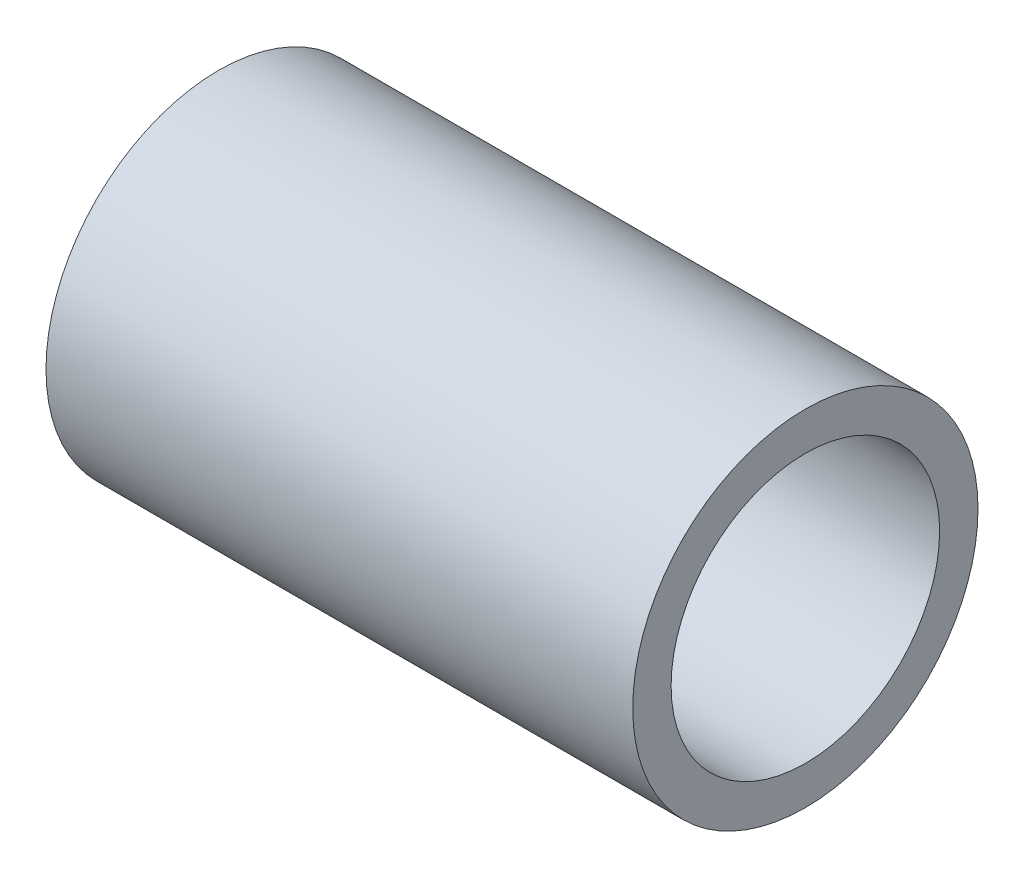
ISO-10303-21;
HEADER;
FILE_DESCRIPTION(('STEP AP214'),'2;1');
FILE_NAME('part.step','',(''),(''),'','','');
FILE_SCHEMA(('AUTOMOTIVE_DESIGN { 1 0 10303 214 1 1 1 1 }'));
ENDSEC;
DATA;
#1=APPLICATION_CONTEXT('core data for automotive mechanical design processes');
#2=APPLICATION_PROTOCOL_DEFINITION('international standard','automotive_design',2000,#1);
#3=PRODUCT_CONTEXT('',#1,'mechanical');
#4=PRODUCT('Part','Part','',(#3));
#5=PRODUCT_RELATED_PRODUCT_CATEGORY('part','',(#4));
#6=PRODUCT_DEFINITION_FORMATION('','',#4);
#7=PRODUCT_DEFINITION_CONTEXT('part definition',#1,'design');
#8=PRODUCT_DEFINITION('design','',#6,#7);
#9=PRODUCT_DEFINITION_SHAPE('','',#8);
#10=(LENGTH_UNIT() NAMED_UNIT(*) SI_UNIT(.MILLI.,.METRE.));
#11=(NAMED_UNIT(*) PLANE_ANGLE_UNIT() SI_UNIT($,.RADIAN.));
#12=(NAMED_UNIT(*) SI_UNIT($,.STERADIAN.) SOLID_ANGLE_UNIT());
#13=UNCERTAINTY_MEASURE_WITH_UNIT(LENGTH_MEASURE(1.E-05),#10,'distance_accuracy_value','');
#14=(GEOMETRIC_REPRESENTATION_CONTEXT(3) GLOBAL_UNCERTAINTY_ASSIGNED_CONTEXT((#13)) GLOBAL_UNIT_ASSIGNED_CONTEXT((#10,
#11,#12)) REPRESENTATION_CONTEXT('',''));
#15=CARTESIAN_POINT('',(0.,0.,0.));
#16=DIRECTION('',(0.,0.,1.));
#17=DIRECTION('',(1.,0.,0.));
#18=AXIS2_PLACEMENT_3D('',#15,#16,#17);
#19=CARTESIAN_POINT('',(54.9123263533988,14.2875,0.));
#20=DIRECTION('',(-1.,0.,0.));
#21=DIRECTION('',(0.,0.,1.));
#22=AXIS2_PLACEMENT_3D('',#19,#20,#21);
#23=PLANE('',#22);
#24=CARTESIAN_POINT('',(54.9123263533988,0.,0.));
#25=DIRECTION('',(-1.,0.,0.));
#26=DIRECTION('',(0.,0.,1.));
#27=AXIS2_PLACEMENT_3D('',#24,#25,#26);
#28=CIRCLE('',#27,14.2875);
#29=CARTESIAN_POINT('',(54.9123263533988,0.,14.2875));
#30=VERTEX_POINT('',#29);
#31=EDGE_CURVE('E62',#30,#30,#28,.T.);
#32=ORIENTED_EDGE('',*,*,#31,.F.);
#33=EDGE_LOOP('',(#32));
#34=FACE_BOUND('',#33,.T.);
#35=CARTESIAN_POINT('',(54.9123263533988,0.,0.));
#36=DIRECTION('',(-1.,0.,0.));
#37=DIRECTION('',(0.,0.,1.));
#38=AXIS2_PLACEMENT_3D('',#35,#36,#37);
#39=CIRCLE('',#38,11.1125);
#40=CARTESIAN_POINT('',(54.9123263533988,0.,11.1125));
#41=VERTEX_POINT('',#40);
#42=EDGE_CURVE('E10',#41,#41,#39,.T.);
#43=ORIENTED_EDGE('',*,*,#42,.T.);
#44=EDGE_LOOP('',(#43));
#45=FACE_BOUND('',#44,.T.);
#46=ADVANCED_FACE('F31',(#34,#45),#23,.F.);
#47=CARTESIAN_POINT('',(0.,0.,0.));
#48=DIRECTION('',(-1.,0.,0.));
#49=DIRECTION('',(0.,0.,1.));
#50=AXIS2_PLACEMENT_3D('',#47,#48,#49);
#51=CYLINDRICAL_SURFACE('',#50,11.1125);
#52=ORIENTED_EDGE('',*,*,#42,.F.);
#53=EDGE_LOOP('',(#52));
#54=FACE_BOUND('',#53,.T.);
#55=CARTESIAN_POINT('',(16.8123263533988,0.,0.));
#56=DIRECTION('',(-1.,0.,0.));
#57=DIRECTION('',(0.,0.,1.));
#58=AXIS2_PLACEMENT_3D('',#55,#56,#57);
#59=CIRCLE('',#58,11.1125);
#60=CARTESIAN_POINT('',(16.8123263533988,0.,-11.1125));
#61=VERTEX_POINT('',#60);
#62=EDGE_CURVE('E37',#61,#61,#59,.T.);
#63=ORIENTED_EDGE('',*,*,#62,.T.);
#64=EDGE_LOOP('',(#63));
#65=FACE_BOUND('',#64,.T.);
#66=ADVANCED_FACE('F69',(#54,#65),#51,.F.);
#67=CARTESIAN_POINT('',(6.34611855089855,0.,0.));
#68=DIRECTION('',(1.,0.,0.));
#69=DIRECTION('',(0.,0.,-1.));
#70=AXIS2_PLACEMENT_3D('',#67,#68,#69);
#71=CONICAL_SURFACE('',#70,2.33030889309725,0.698131700797734);
#72=CARTESIAN_POINT('',(6.34611855089855,0.,0.));
#73=DIRECTION('',(-1.,0.,0.));
#74=DIRECTION('',(0.,0.,1.));
#75=AXIS2_PLACEMENT_3D('',#72,#73,#74);
#76=CIRCLE('',#75,2.33030889309725);
#77=CARTESIAN_POINT('',(6.34611855089855,0.,-2.33030889309725));
#78=VERTEX_POINT('',#77);
#79=EDGE_CURVE('E41',#78,#78,#76,.T.);
#80=CARTESIAN_POINT('',(16.8123263533988,0.,-11.1125));
#81=CARTESIAN_POINT('',(16.7033033554561,0.,-11.0210188426364));
#82=CARTESIAN_POINT('',(16.5942803575134,0.,-10.9295376852729));
#83=CARTESIAN_POINT('',(16.3762343616279,0.,-10.7465753705457));
#84=CARTESIAN_POINT('',(16.2672113636852,0.,-10.6550942131822));
#85=CARTESIAN_POINT('',(16.0491653677998,0.,-10.472131898455));
#86=CARTESIAN_POINT('',(15.9401423698571,0.,-10.3806507410914));
#87=CARTESIAN_POINT('',(15.7220963739717,0.,-10.1976884263643));
#88=CARTESIAN_POINT('',(15.613073376029,0.,-10.1062072690007));
#89=CARTESIAN_POINT('',(15.3950273801435,0.,-9.92324495427359));
#90=CARTESIAN_POINT('',(15.2860043822008,0.,-9.83176379691002));
#91=CARTESIAN_POINT('',(15.0679583863154,0.,-9.64880148218288));
#92=CARTESIAN_POINT('',(14.9589353883727,0.,-9.55732032481931));
#93=CARTESIAN_POINT('',(14.7408893924873,0.,-9.37435801009217));
#94=CARTESIAN_POINT('',(14.6318663945446,0.,-9.2828768527286));
#95=CARTESIAN_POINT('',(14.4138203986591,0.,-9.09991453800145));
#96=CARTESIAN_POINT('',(14.3047974007164,0.,-9.00843338063789));
#97=CARTESIAN_POINT('',(14.086751404831,0.,-8.82547106591075));
#98=CARTESIAN_POINT('',(13.9777284068883,0.,-8.73398990854717));
#99=CARTESIAN_POINT('',(13.7596824110029,0.,-8.55102759382003));
#100=CARTESIAN_POINT('',(13.6506594130602,0.,-8.45954643645646));
#101=CARTESIAN_POINT('',(13.4326134171748,0.,-8.27658412172932));
#102=CARTESIAN_POINT('',(13.323590419232,0.,-8.18510296436575));
#103=CARTESIAN_POINT('',(13.1055444233466,0.,-8.00214064963861));
#104=CARTESIAN_POINT('',(12.9965214254039,0.,-7.91065949227504));
#105=CARTESIAN_POINT('',(12.7784754295185,0.,-7.7276971775479));
#106=CARTESIAN_POINT('',(12.6694524315758,0.,-7.63621602018433));
#107=CARTESIAN_POINT('',(12.4514064356904,0.,-7.45325370545719));
#108=CARTESIAN_POINT('',(12.3423834377476,0.,-7.36177254809362));
#109=CARTESIAN_POINT('',(12.1243374418622,0.,-7.17881023336648));
#110=CARTESIAN_POINT('',(12.0153144439195,0.,-7.08732907600291));
#111=CARTESIAN_POINT('',(11.7972684480341,0.,-6.90436676127577));
#112=CARTESIAN_POINT('',(11.6882454500914,0.,-6.8128856039122));
#113=CARTESIAN_POINT('',(11.470199454206,0.,-6.62992328918506));
#114=CARTESIAN_POINT('',(11.3611764562632,0.,-6.53844213182148));
#115=CARTESIAN_POINT('',(11.1431304603778,0.,-6.35547981709434));
#116=CARTESIAN_POINT('',(11.0341074624351,0.,-6.26399865973077));
#117=CARTESIAN_POINT('',(10.8160614665497,0.,-6.08103634500363));
#118=CARTESIAN_POINT('',(10.707038468607,0.,-5.98955518764006));
#119=CARTESIAN_POINT('',(10.4889924727216,0.,-5.80659287291292));
#120=CARTESIAN_POINT('',(10.3799694747788,0.,-5.71511171554935));
#121=CARTESIAN_POINT('',(10.1619234788934,0.,-5.53214940082221));
#122=CARTESIAN_POINT('',(10.0529004809507,0.,-5.44066824345864));
#123=CARTESIAN_POINT('',(9.83485448506529,0.,-5.2577059287315));
#124=CARTESIAN_POINT('',(9.72583148712258,0.,-5.16622477136793));
#125=CARTESIAN_POINT('',(9.50778549123716,0.,-4.98326245664079));
#126=CARTESIAN_POINT('',(9.39876249329445,0.,-4.89178129927722));
#127=CARTESIAN_POINT('',(9.18071649740903,0.,-4.70881898455008));
#128=CARTESIAN_POINT('',(9.07169349946632,0.,-4.61733782718651));
#129=CARTESIAN_POINT('',(8.8536475035809,0.,-4.43437551245937));
#130=CARTESIAN_POINT('',(8.74462450563819,0.,-4.3428943550958));
#131=CARTESIAN_POINT('',(8.52657850975277,0.,-4.15993204036866));
#132=CARTESIAN_POINT('',(8.41755551181005,0.,-4.06845088300509));
#133=CARTESIAN_POINT('',(8.19950951592463,0.,-3.88548856827795));
#134=CARTESIAN_POINT('',(8.09048651798192,0.,-3.79400741091437));
#135=CARTESIAN_POINT('',(7.8724405220965,0.,-3.61104509618723));
#136=CARTESIAN_POINT('',(7.76341752415379,0.,-3.51956393882366));
#137=CARTESIAN_POINT('',(7.54537152826837,0.,-3.33660162409652));
#138=CARTESIAN_POINT('',(7.43634853032566,0.,-3.24512046673295));
#139=CARTESIAN_POINT('',(7.21830253444023,0.,-3.06215815200581));
#140=CARTESIAN_POINT('',(7.10927953649752,0.,-2.97067699464224));
#141=CARTESIAN_POINT('',(6.8912335406121,0.,-2.7877146799151));
#142=CARTESIAN_POINT('',(6.78221054266939,0.,-2.69623352255153));
#143=CARTESIAN_POINT('',(6.56416454678397,0.,-2.51327120782439));
#144=CARTESIAN_POINT('',(6.45514154884126,0.,-2.42179005046082));
#145=CARTESIAN_POINT('',(6.34611855089855,0.,-2.33030889309725));
#146=B_SPLINE_CURVE_WITH_KNOTS('',3,(#80,#81,#82,#83,#84,#85,#86,#87,#88,#89,#90,#91,#92,#93,
#94,#95,#96,#97,#98,#99,#100,#101,#102,#103,#104,#105,#106,#107,#108,#109,#110,#111,#112,#113,
#114,#115,#116,#117,#118,#119,#120,#121,#122,#123,#124,#125,#126,#127,#128,#129,#130,#131,#132,
#133,#134,#135,#136,#137,#138,#139,#140,#141,#142,#143,#144,#145),.UNSPECIFIED.,.F.,.F.,(4,2,2,
2,2,2,2,2,2,2,2,2,2,2,2,2,2,2,2,2,2,2,2,2,2,2,2,2,2,2,2,2,4),(0.,0.426958248657818,
0.853916497315638,1.28087474597346,1.70783299463127,2.13479124328909,2.56174949194691,
2.98870774060473,3.41566598926255,3.84262423792037,4.26958248657819,4.69654073523601,
5.12349898389382,5.55045723255164,5.97741548120946,6.40437372986728,6.8313319785251,
7.25829022718292,7.68524847584074,8.11220672449855,8.53916497315637,8.96612322181419,
9.39308147047201,9.82003971912983,10.2469979677876,10.6739562164455,11.1009144651033,
11.5278727137611,11.9548309624189,12.3817892110767,12.8087474597346,13.2357057083924,
13.6626639570502),.UNSPECIFIED.);
#147=EDGE_CURVE('BSEAM73',#61,#78,#146,.T.);
#148=ORIENTED_EDGE('',*,*,#62,.F.);
#149=ORIENTED_EDGE('',*,*,#79,.T.);
#150=ORIENTED_EDGE('',*,*,#147,.T.);
#151=ORIENTED_EDGE('',*,*,#147,.F.);
#152=EDGE_LOOP('',(#148,#150,#149,#151));
#153=FACE_BOUND('',#152,.T.);
#154=ADVANCED_FACE('F73',(#153),#71,.F.);
#155=CARTESIAN_POINT('',(4.30526789014378,0.,0.));
#156=DIRECTION('',(-1.,0.,0.));
#157=DIRECTION('',(0.,0.,1.));
#158=AXIS2_PLACEMENT_3D('',#155,#156,#157);
#159=TOROIDAL_SURFACE('',#158,4.7625,3.175);
#160=ORIENTED_EDGE('',*,*,#79,.F.);
#161=EDGE_LOOP('',(#160));
#162=FACE_BOUND('',#161,.T.);
#163=CARTESIAN_POINT('',(3.48351742194329,0.,0.));
#164=DIRECTION('',(-1.,0.,0.));
#165=DIRECTION('',(0.,0.,1.));
#166=AXIS2_PLACEMENT_3D('',#163,#164,#165);
#167=CIRCLE('',#166,1.6956855015322);
#168=CARTESIAN_POINT('',(3.48351742194329,0.,1.6956855015322));
#169=VERTEX_POINT('',#168);
#170=EDGE_CURVE('E45',#169,#169,#167,.T.);
#171=ORIENTED_EDGE('',*,*,#170,.T.);
#172=EDGE_LOOP('',(#171));
#173=FACE_BOUND('',#172,.T.);
#174=ADVANCED_FACE('F78',(#162,#173),#159,.T.);
#175=CARTESIAN_POINT('',(0.,0.,0.));
#176=DIRECTION('',(-1.,0.,0.));
#177=DIRECTION('',(0.,0.,1.));
#178=AXIS2_PLACEMENT_3D('',#175,#176,#177);
#179=CONICAL_SURFACE('',#178,2.62909118156163,0.261799387799143);
#180=ORIENTED_EDGE('',*,*,#170,.F.);
#181=EDGE_LOOP('',(#180));
#182=FACE_BOUND('',#181,.T.);
#183=CARTESIAN_POINT('',(0.,0.,0.));
#184=DIRECTION('',(-1.,0.,0.));
#185=DIRECTION('',(0.,0.,1.));
#186=AXIS2_PLACEMENT_3D('',#183,#184,#185);
#187=CIRCLE('',#186,2.62909118156163);
#188=CARTESIAN_POINT('',(0.,0.,2.62909118156163));
#189=VERTEX_POINT('',#188);
#190=EDGE_CURVE('E50',#189,#189,#187,.T.);
#191=ORIENTED_EDGE('',*,*,#190,.T.);
#192=EDGE_LOOP('',(#191));
#193=FACE_BOUND('',#192,.T.);
#194=ADVANCED_FACE('F84',(#182,#193),#179,.F.);
#195=CARTESIAN_POINT('',(0.,2.62909118156163,0.));
#196=DIRECTION('',(1.,0.,0.));
#197=DIRECTION('',(0.,0.,-1.));
#198=AXIS2_PLACEMENT_3D('',#195,#196,#197);
#199=PLANE('',#198);
#200=ORIENTED_EDGE('',*,*,#190,.F.);
#201=EDGE_LOOP('',(#200));
#202=FACE_BOUND('',#201,.T.);
#203=CARTESIAN_POINT('',(0.,0.,0.));
#204=DIRECTION('',(-1.,0.,0.));
#205=DIRECTION('',(0.,0.,1.));
#206=AXIS2_PLACEMENT_3D('',#203,#204,#205);
#207=CIRCLE('',#206,4.60375);
#208=CARTESIAN_POINT('',(0.,0.,4.60375));
#209=VERTEX_POINT('',#208);
#210=EDGE_CURVE('E53',#209,#209,#207,.T.);
#211=ORIENTED_EDGE('',*,*,#210,.T.);
#212=EDGE_LOOP('',(#211));
#213=FACE_BOUND('',#212,.T.);
#214=ADVANCED_FACE('F88',(#202,#213),#199,.F.);
#215=CARTESIAN_POINT('',(0.,0.,0.));
#216=DIRECTION('',(-1.,0.,0.));
#217=DIRECTION('',(0.,0.,1.));
#218=AXIS2_PLACEMENT_3D('',#215,#216,#217);
#219=CYLINDRICAL_SURFACE('',#218,4.60375);
#220=ORIENTED_EDGE('',*,*,#210,.F.);
#221=EDGE_LOOP('',(#220));
#222=FACE_BOUND('',#221,.T.);
#223=CARTESIAN_POINT('',(6.35,0.,0.));
#224=DIRECTION('',(-1.,0.,0.));
#225=DIRECTION('',(0.,0.,1.));
#226=AXIS2_PLACEMENT_3D('',#223,#224,#225);
#227=CIRCLE('',#226,4.60375);
#228=CARTESIAN_POINT('',(6.35,0.,4.60375));
#229=VERTEX_POINT('',#228);
#230=EDGE_CURVE('E56',#229,#229,#227,.T.);
#231=ORIENTED_EDGE('',*,*,#230,.T.);
#232=EDGE_LOOP('',(#231));
#233=FACE_BOUND('',#232,.T.);
#234=ADVANCED_FACE('F92',(#222,#233),#219,.T.);
#235=CARTESIAN_POINT('',(6.35,4.60375,0.));
#236=DIRECTION('',(1.,0.,0.));
#237=DIRECTION('',(0.,0.,-1.));
#238=AXIS2_PLACEMENT_3D('',#235,#236,#237);
#239=PLANE('',#238);
#240=ORIENTED_EDGE('',*,*,#230,.F.);
#241=EDGE_LOOP('',(#240));
#242=FACE_BOUND('',#241,.T.);
#243=CARTESIAN_POINT('',(6.35,0.,0.));
#244=DIRECTION('',(-1.,0.,0.));
#245=DIRECTION('',(0.,0.,1.));
#246=AXIS2_PLACEMENT_3D('',#243,#244,#245);
#247=CIRCLE('',#246,14.2875);
#248=CARTESIAN_POINT('',(6.35,0.,14.2875));
#249=VERTEX_POINT('',#248);
#250=EDGE_CURVE('E59',#249,#249,#247,.T.);
#251=ORIENTED_EDGE('',*,*,#250,.T.);
#252=EDGE_LOOP('',(#251));
#253=FACE_BOUND('',#252,.T.);
#254=ADVANCED_FACE('F96',(#242,#253),#239,.F.);
#255=CARTESIAN_POINT('',(0.,0.,0.));
#256=DIRECTION('',(-1.,0.,0.));
#257=DIRECTION('',(0.,0.,1.));
#258=AXIS2_PLACEMENT_3D('',#255,#256,#257);
#259=CYLINDRICAL_SURFACE('',#258,14.2875);
#260=ORIENTED_EDGE('',*,*,#250,.F.);
#261=EDGE_LOOP('',(#260));
#262=FACE_BOUND('',#261,.T.);
#263=ORIENTED_EDGE('',*,*,#31,.T.);
#264=EDGE_LOOP('',(#263));
#265=FACE_BOUND('',#264,.T.);
#266=ADVANCED_FACE('F66',(#262,#265),#259,.T.);
#267=CLOSED_SHELL('',(#46,#66,#154,#174,#194,#214,#234,#254,#266));
#268=MANIFOLD_SOLID_BREP('B2',#267);
#269=ADVANCED_BREP_SHAPE_REPRESENTATION('',(#18,#268),#14);
#270=SHAPE_DEFINITION_REPRESENTATION(#9,#269);
ENDSEC;
END-ISO-10303-21;
